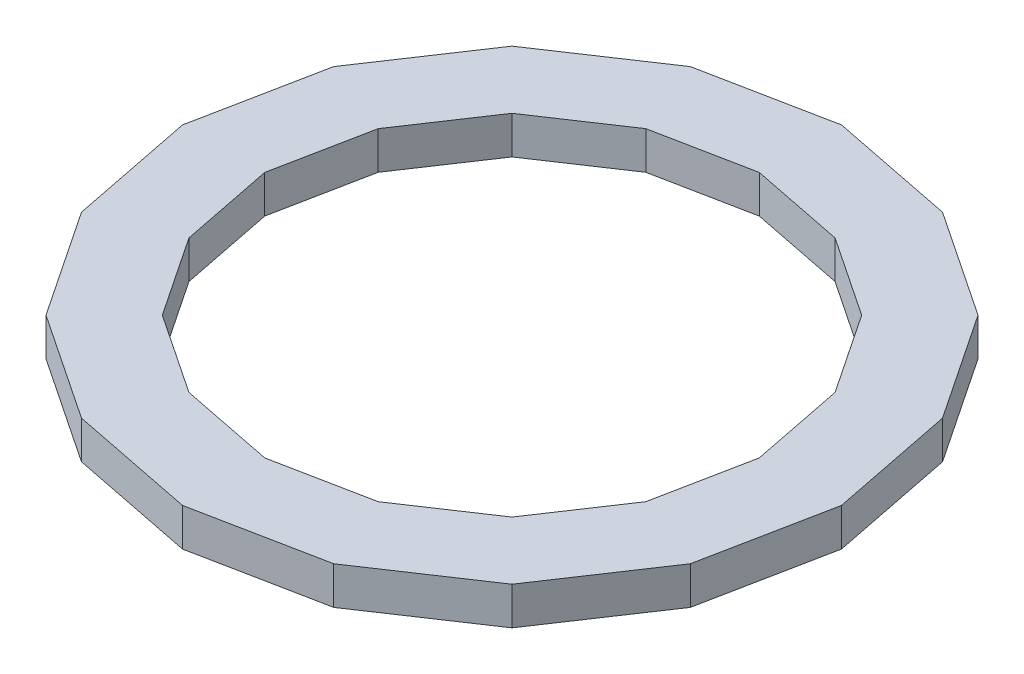
ISO-10303-21;
HEADER;
FILE_DESCRIPTION(('STEP AP214'),'2;1');
FILE_NAME('part.step','',(''),(''),'','','');
FILE_SCHEMA(('AUTOMOTIVE_DESIGN { 1 0 10303 214 1 1 1 1 }'));
ENDSEC;
DATA;
#1=APPLICATION_CONTEXT('core data for automotive mechanical design processes');
#2=APPLICATION_PROTOCOL_DEFINITION('international standard','automotive_design',2000,#1);
#3=PRODUCT_CONTEXT('',#1,'mechanical');
#4=PRODUCT('Part','Part','',(#3));
#5=PRODUCT_RELATED_PRODUCT_CATEGORY('part','',(#4));
#6=PRODUCT_DEFINITION_FORMATION('','',#4);
#7=PRODUCT_DEFINITION_CONTEXT('part definition',#1,'design');
#8=PRODUCT_DEFINITION('design','',#6,#7);
#9=PRODUCT_DEFINITION_SHAPE('','',#8);
#10=(LENGTH_UNIT() NAMED_UNIT(*) SI_UNIT(.MILLI.,.METRE.));
#11=(NAMED_UNIT(*) PLANE_ANGLE_UNIT() SI_UNIT($,.RADIAN.));
#12=(NAMED_UNIT(*) SI_UNIT($,.STERADIAN.) SOLID_ANGLE_UNIT());
#13=UNCERTAINTY_MEASURE_WITH_UNIT(LENGTH_MEASURE(1.E-05),#10,'distance_accuracy_value','');
#14=(GEOMETRIC_REPRESENTATION_CONTEXT(3) GLOBAL_UNCERTAINTY_ASSIGNED_CONTEXT((#13)) GLOBAL_UNIT_ASSIGNED_CONTEXT((#10,
#11,#12)) REPRESENTATION_CONTEXT('',''));
#15=CARTESIAN_POINT('',(0.,0.,0.));
#16=DIRECTION('',(0.,0.,1.));
#17=DIRECTION('',(1.,0.,0.));
#18=AXIS2_PLACEMENT_3D('',#15,#16,#17);
#19=CARTESIAN_POINT('',(0.,19.05,0.));
#20=DIRECTION('',(0.,1.,0.));
#21=DIRECTION('',(0.,0.,1.));
#22=AXIS2_PLACEMENT_3D('',#19,#20,#21);
#23=PLANE('',#22);
#24=DIRECTION('',(0.195090322016117,0.,-0.980785280403233));
#25=VECTOR('',#24,1.);
#26=CARTESIAN_POINT('',(153.364033393234,19.05,63.5254626117155));
#27=LINE('',#26,#25);
#28=CARTESIAN_POINT('',(153.364033393234,19.05,63.5254626117155));
#29=VERTEX_POINT('',#28);
#30=CARTESIAN_POINT('',(166.000033550218,19.05,-1.92901743612494E-12));
#31=VERTEX_POINT('',#30);
#32=EDGE_CURVE('E384',#29,#31,#27,.T.);
#33=ORIENTED_EDGE('',*,*,#32,.T.);
#34=DIRECTION('',(-0.19509032201614,0.,-0.980785280403228));
#35=VECTOR('',#34,1.);
#36=CARTESIAN_POINT('',(166.000033550218,19.05,-1.92901743612494E-12));
#37=LINE('',#36,#35);
#38=CARTESIAN_POINT('',(153.364033393232,19.05,-63.525462611719));
#39=VERTEX_POINT('',#38);
#40=EDGE_CURVE('E388',#31,#39,#37,.T.);
#41=ORIENTED_EDGE('',*,*,#40,.T.);
#42=DIRECTION('',(-0.555570233019612,0.,-0.831469612302539));
#43=VECTOR('',#42,1.);
#44=CARTESIAN_POINT('',(153.364033393232,19.05,-63.525462611719));
#45=LINE('',#44,#43);
#46=CARTESIAN_POINT('',(117.379749400552,19.05,-117.379749400555));
#47=VERTEX_POINT('',#46);
#48=EDGE_CURVE('E392',#39,#47,#45,.T.);
#49=ORIENTED_EDGE('',*,*,#48,.T.);
#50=DIRECTION('',(-0.831469612302551,0.,-0.555570233019593));
#51=VECTOR('',#50,1.);
#52=CARTESIAN_POINT('',(117.379749400552,19.05,-117.379749400555));
#53=LINE('',#52,#51);
#54=CARTESIAN_POINT('',(63.5254626117157,19.05,-153.364033393234));
#55=VERTEX_POINT('',#54);
#56=EDGE_CURVE('E395',#47,#55,#53,.T.);
#57=ORIENTED_EDGE('',*,*,#56,.T.);
#58=DIRECTION('',(-0.980785280403233,0.,-0.195090322016117));
#59=VECTOR('',#58,1.);
#60=CARTESIAN_POINT('',(63.5254626117157,19.05,-153.364033393234));
#61=LINE('',#60,#59);
#62=CARTESIAN_POINT('',(-1.97192316033267E-12,19.05,-166.000033550217));
#63=VERTEX_POINT('',#62);
#64=EDGE_CURVE('E397',#55,#63,#61,.T.);
#65=ORIENTED_EDGE('',*,*,#64,.T.);
#66=DIRECTION('',(-0.980785280403228,0.,0.195090322016139));
#67=VECTOR('',#66,1.);
#68=CARTESIAN_POINT('',(-1.97192316033267E-12,19.05,-166.000033550217));
#69=LINE('',#68,#67);
#70=CARTESIAN_POINT('',(-63.5254626117191,19.05,-153.364033393232));
#71=VERTEX_POINT('',#70);
#72=EDGE_CURVE('E399',#63,#71,#69,.T.);
#73=ORIENTED_EDGE('',*,*,#72,.T.);
#74=DIRECTION('',(-0.831469612302539,0.,0.555570233019612));
#75=VECTOR('',#74,1.);
#76=CARTESIAN_POINT('',(-63.5254626117191,19.05,-153.364033393232));
#77=LINE('',#76,#75);
#78=CARTESIAN_POINT('',(-117.379749400554,19.05,-117.379749400552));
#79=VERTEX_POINT('',#78);
#80=EDGE_CURVE('E402',#71,#79,#77,.T.);
#81=ORIENTED_EDGE('',*,*,#80,.T.);
#82=DIRECTION('',(-0.555570233019593,0.,0.831469612302552));
#83=VECTOR('',#82,1.);
#84=CARTESIAN_POINT('',(-117.379749400554,19.05,-117.379749400552));
#85=LINE('',#84,#83);
#86=CARTESIAN_POINT('',(-153.364033393234,19.05,-63.5254626117154));
#87=VERTEX_POINT('',#86);
#88=EDGE_CURVE('E404',#79,#87,#85,.T.);
#89=ORIENTED_EDGE('',*,*,#88,.T.);
#90=DIRECTION('',(-0.195090322016117,0.,0.980785280403233));
#91=VECTOR('',#90,1.);
#92=CARTESIAN_POINT('',(-153.364033393234,19.05,-63.5254626117154));
#93=LINE('',#92,#91);
#94=CARTESIAN_POINT('',(-166.000033550217,19.05,1.93708909736286E-12));
#95=VERTEX_POINT('',#94);
#96=EDGE_CURVE('E406',#87,#95,#93,.T.);
#97=ORIENTED_EDGE('',*,*,#96,.T.);
#98=DIRECTION('',(0.19509032201614,0.,0.980785280403228));
#99=VECTOR('',#98,1.);
#100=CARTESIAN_POINT('',(-166.000033550217,19.05,1.93708909736286E-12));
#101=LINE('',#100,#99);
#102=CARTESIAN_POINT('',(-153.364033393232,19.05,63.525462611719));
#103=VERTEX_POINT('',#102);
#104=EDGE_CURVE('E408',#95,#103,#101,.T.);
#105=ORIENTED_EDGE('',*,*,#104,.T.);
#106=DIRECTION('',(0.555570233019611,0.,0.831469612302539));
#107=VECTOR('',#106,1.);
#108=CARTESIAN_POINT('',(-153.364033393232,19.05,63.525462611719));
#109=LINE('',#108,#107);
#110=CARTESIAN_POINT('',(-117.379749400552,19.05,117.379749400555));
#111=VERTEX_POINT('',#110);
#112=EDGE_CURVE('E410',#103,#111,#109,.T.);
#113=ORIENTED_EDGE('',*,*,#112,.T.);
#114=DIRECTION('',(0.831469612302552,0.,0.555570233019593));
#115=VECTOR('',#114,1.);
#116=CARTESIAN_POINT('',(-117.379749400552,19.05,117.379749400555));
#117=LINE('',#116,#115);
#118=CARTESIAN_POINT('',(-63.5254626117156,19.05,153.364033393234));
#119=VERTEX_POINT('',#118);
#120=EDGE_CURVE('E412',#111,#119,#117,.T.);
#121=ORIENTED_EDGE('',*,*,#120,.T.);
#122=DIRECTION('',(0.980785280403233,0.,0.195090322016117));
#123=VECTOR('',#122,1.);
#124=CARTESIAN_POINT('',(-63.5254626117156,19.05,153.364033393234));
#125=LINE('',#124,#123);
#126=CARTESIAN_POINT('',(1.87331270362792E-12,19.05,166.000033550217));
#127=VERTEX_POINT('',#126);
#128=EDGE_CURVE('E414',#119,#127,#125,.T.);
#129=ORIENTED_EDGE('',*,*,#128,.T.);
#130=DIRECTION('',(0.980785280403228,0.,-0.195090322016139));
#131=VECTOR('',#130,1.);
#132=CARTESIAN_POINT('',(1.87331270362792E-12,19.05,166.000033550217));
#133=LINE('',#132,#131);
#134=CARTESIAN_POINT('',(63.5254626117191,19.05,153.364033393232));
#135=VERTEX_POINT('',#134);
#136=EDGE_CURVE('E416',#127,#135,#133,.T.);
#137=ORIENTED_EDGE('',*,*,#136,.T.);
#138=DIRECTION('',(0.831469612302539,0.,-0.555570233019612));
#139=VECTOR('',#138,1.);
#140=CARTESIAN_POINT('',(63.5254626117191,19.05,153.364033393232));
#141=LINE('',#140,#139);
#142=CARTESIAN_POINT('',(117.379749400555,19.05,117.379749400552));
#143=VERTEX_POINT('',#142);
#144=EDGE_CURVE('E418',#135,#143,#141,.T.);
#145=ORIENTED_EDGE('',*,*,#144,.T.);
#146=DIRECTION('',(0.555570233019593,0.,-0.831469612302551));
#147=VECTOR('',#146,1.);
#148=CARTESIAN_POINT('',(117.379749400555,19.05,117.379749400552));
#149=LINE('',#148,#147);
#150=EDGE_CURVE('E420',#143,#29,#149,.T.);
#151=ORIENTED_EDGE('',*,*,#150,.T.);
#152=EDGE_LOOP('',(#33,#41,#49,#57,#65,#73,#81,#89,#97,#105,#113,#121,#129,#137,#145,#151));
#153=FACE_BOUND('',#152,.T.);
#154=DIRECTION('',(-0.19509032201614,0.,-0.980785280403228));
#155=VECTOR('',#154,1.);
#156=CARTESIAN_POINT('',(124.563848880631,19.05,-1.45694102306958E-12));
#157=LINE('',#156,#155);
#158=CARTESIAN_POINT('',(124.563848880631,19.05,-1.45694102306958E-12));
#159=VERTEX_POINT('',#158);
#160=CARTESIAN_POINT('',(115.081990471644,19.05,-47.6685212382477));
#161=VERTEX_POINT('',#160);
#162=EDGE_CURVE('E253',#159,#161,#157,.T.);
#163=ORIENTED_EDGE('',*,*,#162,.F.);
#164=DIRECTION('',(0.195090322016117,0.,-0.980785280403233));
#165=VECTOR('',#164,1.);
#166=CARTESIAN_POINT('',(115.081990471645,19.05,47.668521238245));
#167=LINE('',#166,#165);
#168=CARTESIAN_POINT('',(115.081990471645,19.05,47.668521238245));
#169=VERTEX_POINT('',#168);
#170=EDGE_CURVE('E244',#169,#159,#167,.T.);
#171=ORIENTED_EDGE('',*,*,#170,.F.);
#172=DIRECTION('',(0.555570233019593,0.,-0.831469612302552));
#173=VECTOR('',#172,1.);
#174=CARTESIAN_POINT('',(88.0799422341919,19.05,88.0799422341898));
#175=LINE('',#174,#173);
#176=CARTESIAN_POINT('',(88.0799422341919,19.05,88.0799422341898));
#177=VERTEX_POINT('',#176);
#178=EDGE_CURVE('E305',#177,#169,#175,.T.);
#179=ORIENTED_EDGE('',*,*,#178,.F.);
#180=DIRECTION('',(0.831469612302539,0.,-0.555570233019612));
#181=VECTOR('',#180,1.);
#182=CARTESIAN_POINT('',(47.6685212382477,19.05,115.081990471644));
#183=LINE('',#182,#181);
#184=CARTESIAN_POINT('',(47.6685212382477,19.05,115.081990471644));
#185=VERTEX_POINT('',#184);
#186=EDGE_CURVE('E303',#185,#177,#183,.T.);
#187=ORIENTED_EDGE('',*,*,#186,.F.);
#188=DIRECTION('',(0.980785280403228,0.,-0.19509032201614));
#189=VECTOR('',#188,1.);
#190=CARTESIAN_POINT('',(1.41953565217536E-12,19.05,124.563848880631));
#191=LINE('',#190,#189);
#192=CARTESIAN_POINT('',(1.41953565217536E-12,19.05,124.563848880631));
#193=VERTEX_POINT('',#192);
#194=EDGE_CURVE('E301',#193,#185,#191,.T.);
#195=ORIENTED_EDGE('',*,*,#194,.F.);
#196=DIRECTION('',(0.980785280403233,0.,0.195090322016117));
#197=VECTOR('',#196,1.);
#198=CARTESIAN_POINT('',(-47.6685212382451,19.05,115.081990471645));
#199=LINE('',#198,#197);
#200=CARTESIAN_POINT('',(-47.6685212382451,19.05,115.081990471645));
#201=VERTEX_POINT('',#200);
#202=EDGE_CURVE('E299',#201,#193,#199,.T.);
#203=ORIENTED_EDGE('',*,*,#202,.F.);
#204=DIRECTION('',(0.831469612302552,0.,0.555570233019592));
#205=VECTOR('',#204,1.);
#206=CARTESIAN_POINT('',(-88.0799422341898,19.05,88.0799422341919));
#207=LINE('',#206,#205);
#208=CARTESIAN_POINT('',(-88.0799422341898,19.05,88.0799422341919));
#209=VERTEX_POINT('',#208);
#210=EDGE_CURVE('E297',#209,#201,#207,.T.);
#211=ORIENTED_EDGE('',*,*,#210,.F.);
#212=DIRECTION('',(0.555570233019612,0.,0.831469612302539));
#213=VECTOR('',#212,1.);
#214=CARTESIAN_POINT('',(-115.081990471644,19.05,47.6685212382478));
#215=LINE('',#214,#213);
#216=CARTESIAN_POINT('',(-115.081990471644,19.05,47.6685212382478));
#217=VERTEX_POINT('',#216);
#218=EDGE_CURVE('E294',#217,#209,#215,.T.);
#219=ORIENTED_EDGE('',*,*,#218,.F.);
#220=DIRECTION('',(0.19509032201614,0.,0.980785280403228));
#221=VECTOR('',#220,1.);
#222=CARTESIAN_POINT('',(-124.563848880631,19.05,1.42239633256056E-12));
#223=LINE('',#222,#221);
#224=CARTESIAN_POINT('',(-124.563848880631,19.05,1.42239633256056E-12));
#225=VERTEX_POINT('',#224);
#226=EDGE_CURVE('E292',#225,#217,#223,.T.);
#227=ORIENTED_EDGE('',*,*,#226,.F.);
#228=DIRECTION('',(-0.195090322016117,0.,0.980785280403233));
#229=VECTOR('',#228,1.);
#230=CARTESIAN_POINT('',(-115.081990471645,19.05,-47.668521238245));
#231=LINE('',#230,#229);
#232=CARTESIAN_POINT('',(-115.081990471645,19.05,-47.668521238245));
#233=VERTEX_POINT('',#232);
#234=EDGE_CURVE('E289',#233,#225,#231,.T.);
#235=ORIENTED_EDGE('',*,*,#234,.F.);
#236=DIRECTION('',(-0.555570233019592,0.,0.831469612302552));
#237=VECTOR('',#236,1.);
#238=CARTESIAN_POINT('',(-88.0799422341919,19.05,-88.0799422341898));
#239=LINE('',#238,#237);
#240=CARTESIAN_POINT('',(-88.0799422341919,19.05,-88.0799422341898));
#241=VERTEX_POINT('',#240);
#242=EDGE_CURVE('E286',#241,#233,#239,.T.);
#243=ORIENTED_EDGE('',*,*,#242,.F.);
#244=DIRECTION('',(-0.831469612302539,0.,0.555570233019612));
#245=VECTOR('',#244,1.);
#246=CARTESIAN_POINT('',(-47.6685212382478,19.05,-115.081990471644));
#247=LINE('',#246,#245);
#248=CARTESIAN_POINT('',(-47.6685212382478,19.05,-115.081990471644));
#249=VERTEX_POINT('',#248);
#250=EDGE_CURVE('E283',#249,#241,#247,.T.);
#251=ORIENTED_EDGE('',*,*,#250,.F.);
#252=DIRECTION('',(-0.980785280403228,0.,0.19509032201614));
#253=VECTOR('',#252,1.);
#254=CARTESIAN_POINT('',(-1.54699223464568E-12,19.05,-124.563848880631));
#255=LINE('',#254,#253);
#256=CARTESIAN_POINT('',(-1.54699223464568E-12,19.05,-124.563848880631));
#257=VERTEX_POINT('',#256);
#258=EDGE_CURVE('E281',#257,#249,#255,.T.);
#259=ORIENTED_EDGE('',*,*,#258,.F.);
#260=DIRECTION('',(-0.980785280403233,0.,-0.195090322016117));
#261=VECTOR('',#260,1.);
#262=CARTESIAN_POINT('',(47.6685212382451,19.05,-115.081990471645));
#263=LINE('',#262,#261);
#264=CARTESIAN_POINT('',(47.6685212382451,19.05,-115.081990471645));
#265=VERTEX_POINT('',#264);
#266=EDGE_CURVE('E278',#265,#257,#263,.T.);
#267=ORIENTED_EDGE('',*,*,#266,.F.);
#268=DIRECTION('',(-0.831469612302552,0.,-0.555570233019592));
#269=VECTOR('',#268,1.);
#270=CARTESIAN_POINT('',(88.0799422341898,19.05,-88.0799422341919));
#271=LINE('',#270,#269);
#272=CARTESIAN_POINT('',(88.0799422341898,19.05,-88.0799422341919));
#273=VERTEX_POINT('',#272);
#274=EDGE_CURVE('E273',#273,#265,#271,.T.);
#275=ORIENTED_EDGE('',*,*,#274,.F.);
#276=DIRECTION('',(-0.555570233019612,0.,-0.831469612302539));
#277=VECTOR('',#276,1.);
#278=CARTESIAN_POINT('',(115.081990471644,19.05,-47.6685212382477));
#279=LINE('',#278,#277);
#280=EDGE_CURVE('E266',#161,#273,#279,.T.);
#281=ORIENTED_EDGE('',*,*,#280,.F.);
#282=EDGE_LOOP('',(#163,#171,#179,#187,#195,#203,#211,#219,#227,#235,#243,#251,#259,#267,#275,#281));
#283=FACE_BOUND('',#282,.T.);
#284=ADVANCED_FACE('F35',(#153,#283),#23,.T.);
#285=CARTESIAN_POINT('',(0.,0.,0.));
#286=DIRECTION('',(0.,1.,0.));
#287=DIRECTION('',(0.,0.,1.));
#288=AXIS2_PLACEMENT_3D('',#285,#286,#287);
#289=PLANE('',#288);
#290=DIRECTION('',(0.195090322016117,0.,-0.980785280403233));
#291=VECTOR('',#290,1.);
#292=CARTESIAN_POINT('',(153.364033393234,0.,63.5254626117155));
#293=LINE('',#292,#291);
#294=CARTESIAN_POINT('',(153.364033393234,0.,63.5254626117155));
#295=VERTEX_POINT('',#294);
#296=CARTESIAN_POINT('',(166.000033550218,0.,-1.92901743612494E-12));
#297=VERTEX_POINT('',#296);
#298=EDGE_CURVE('E261',#295,#297,#293,.T.);
#299=ORIENTED_EDGE('',*,*,#298,.F.);
#300=DIRECTION('',(0.555570233019593,0.,-0.831469612302551));
#301=VECTOR('',#300,1.);
#302=CARTESIAN_POINT('',(117.379749400555,0.,117.379749400552));
#303=LINE('',#302,#301);
#304=CARTESIAN_POINT('',(117.379749400555,0.,117.379749400552));
#305=VERTEX_POINT('',#304);
#306=EDGE_CURVE('E389',#305,#295,#303,.T.);
#307=ORIENTED_EDGE('',*,*,#306,.F.);
#308=DIRECTION('',(0.831469612302539,0.,-0.555570233019612));
#309=VECTOR('',#308,1.);
#310=CARTESIAN_POINT('',(63.5254626117191,0.,153.364033393232));
#311=LINE('',#310,#309);
#312=CARTESIAN_POINT('',(63.5254626117191,0.,153.364033393232));
#313=VERTEX_POINT('',#312);
#314=EDGE_CURVE('E454',#313,#305,#311,.T.);
#315=ORIENTED_EDGE('',*,*,#314,.F.);
#316=DIRECTION('',(0.980785280403228,0.,-0.195090322016139));
#317=VECTOR('',#316,1.);
#318=CARTESIAN_POINT('',(1.87331270362792E-12,0.,166.000033550217));
#319=LINE('',#318,#317);
#320=CARTESIAN_POINT('',(1.87331270362792E-12,0.,166.000033550217));
#321=VERTEX_POINT('',#320);
#322=EDGE_CURVE('E452',#321,#313,#319,.T.);
#323=ORIENTED_EDGE('',*,*,#322,.F.);
#324=DIRECTION('',(0.980785280403233,0.,0.195090322016117));
#325=VECTOR('',#324,1.);
#326=CARTESIAN_POINT('',(-63.5254626117156,0.,153.364033393234));
#327=LINE('',#326,#325);
#328=CARTESIAN_POINT('',(-63.5254626117156,0.,153.364033393234));
#329=VERTEX_POINT('',#328);
#330=EDGE_CURVE('E449',#329,#321,#327,.T.);
#331=ORIENTED_EDGE('',*,*,#330,.F.);
#332=DIRECTION('',(0.831469612302552,0.,0.555570233019593));
#333=VECTOR('',#332,1.);
#334=CARTESIAN_POINT('',(-117.379749400552,0.,117.379749400555));
#335=LINE('',#334,#333);
#336=CARTESIAN_POINT('',(-117.379749400552,0.,117.379749400555));
#337=VERTEX_POINT('',#336);
#338=EDGE_CURVE('E447',#337,#329,#335,.T.);
#339=ORIENTED_EDGE('',*,*,#338,.F.);
#340=DIRECTION('',(0.555570233019611,0.,0.831469612302539));
#341=VECTOR('',#340,1.);
#342=CARTESIAN_POINT('',(-153.364033393232,0.,63.525462611719));
#343=LINE('',#342,#341);
#344=CARTESIAN_POINT('',(-153.364033393232,0.,63.525462611719));
#345=VERTEX_POINT('',#344);
#346=EDGE_CURVE('E445',#345,#337,#343,.T.);
#347=ORIENTED_EDGE('',*,*,#346,.F.);
#348=DIRECTION('',(0.19509032201614,0.,0.980785280403228));
#349=VECTOR('',#348,1.);
#350=CARTESIAN_POINT('',(-166.000033550217,0.,1.93708909736286E-12));
#351=LINE('',#350,#349);
#352=CARTESIAN_POINT('',(-166.000033550217,0.,1.93708909736286E-12));
#353=VERTEX_POINT('',#352);
#354=EDGE_CURVE('E443',#353,#345,#351,.T.);
#355=ORIENTED_EDGE('',*,*,#354,.F.);
#356=DIRECTION('',(-0.195090322016117,0.,0.980785280403233));
#357=VECTOR('',#356,1.);
#358=CARTESIAN_POINT('',(-153.364033393234,0.,-63.5254626117154));
#359=LINE('',#358,#357);
#360=CARTESIAN_POINT('',(-153.364033393234,0.,-63.5254626117154));
#361=VERTEX_POINT('',#360);
#362=EDGE_CURVE('E441',#361,#353,#359,.T.);
#363=ORIENTED_EDGE('',*,*,#362,.F.);
#364=DIRECTION('',(-0.555570233019593,0.,0.831469612302552));
#365=VECTOR('',#364,1.);
#366=CARTESIAN_POINT('',(-117.379749400554,0.,-117.379749400552));
#367=LINE('',#366,#365);
#368=CARTESIAN_POINT('',(-117.379749400554,0.,-117.379749400552));
#369=VERTEX_POINT('',#368);
#370=EDGE_CURVE('E439',#369,#361,#367,.T.);
#371=ORIENTED_EDGE('',*,*,#370,.F.);
#372=DIRECTION('',(-0.831469612302539,0.,0.555570233019612));
#373=VECTOR('',#372,1.);
#374=CARTESIAN_POINT('',(-63.5254626117191,0.,-153.364033393232));
#375=LINE('',#374,#373);
#376=CARTESIAN_POINT('',(-63.5254626117191,0.,-153.364033393232));
#377=VERTEX_POINT('',#376);
#378=EDGE_CURVE('E437',#377,#369,#375,.T.);
#379=ORIENTED_EDGE('',*,*,#378,.F.);
#380=DIRECTION('',(-0.980785280403228,0.,0.195090322016139));
#381=VECTOR('',#380,1.);
#382=CARTESIAN_POINT('',(-1.97192316033267E-12,0.,-166.000033550217));
#383=LINE('',#382,#381);
#384=CARTESIAN_POINT('',(-1.97192316033267E-12,0.,-166.000033550217));
#385=VERTEX_POINT('',#384);
#386=EDGE_CURVE('E435',#385,#377,#383,.T.);
#387=ORIENTED_EDGE('',*,*,#386,.F.);
#388=DIRECTION('',(-0.980785280403233,0.,-0.195090322016117));
#389=VECTOR('',#388,1.);
#390=CARTESIAN_POINT('',(63.5254626117157,0.,-153.364033393234));
#391=LINE('',#390,#389);
#392=CARTESIAN_POINT('',(63.5254626117157,0.,-153.364033393234));
#393=VERTEX_POINT('',#392);
#394=EDGE_CURVE('E433',#393,#385,#391,.T.);
#395=ORIENTED_EDGE('',*,*,#394,.F.);
#396=DIRECTION('',(-0.831469612302551,0.,-0.555570233019593));
#397=VECTOR('',#396,1.);
#398=CARTESIAN_POINT('',(117.379749400552,0.,-117.379749400555));
#399=LINE('',#398,#397);
#400=CARTESIAN_POINT('',(117.379749400552,0.,-117.379749400555));
#401=VERTEX_POINT('',#400);
#402=EDGE_CURVE('E431',#401,#393,#399,.T.);
#403=ORIENTED_EDGE('',*,*,#402,.F.);
#404=DIRECTION('',(-0.555570233019612,0.,-0.831469612302539));
#405=VECTOR('',#404,1.);
#406=CARTESIAN_POINT('',(153.364033393232,0.,-63.525462611719));
#407=LINE('',#406,#405);
#408=CARTESIAN_POINT('',(153.364033393232,0.,-63.525462611719));
#409=VERTEX_POINT('',#408);
#410=EDGE_CURVE('E428',#409,#401,#407,.T.);
#411=ORIENTED_EDGE('',*,*,#410,.F.);
#412=DIRECTION('',(-0.19509032201614,0.,-0.980785280403228));
#413=VECTOR('',#412,1.);
#414=CARTESIAN_POINT('',(166.000033550218,0.,-1.92901743612494E-12));
#415=LINE('',#414,#413);
#416=EDGE_CURVE('E425',#297,#409,#415,.T.);
#417=ORIENTED_EDGE('',*,*,#416,.F.);
#418=EDGE_LOOP('',(#299,#307,#315,#323,#331,#339,#347,#355,#363,#371,#379,#387,#395,#403,#411,#417));
#419=FACE_BOUND('',#418,.T.);
#420=DIRECTION('',(0.195090322016117,0.,-0.980785280403233));
#421=VECTOR('',#420,1.);
#422=CARTESIAN_POINT('',(115.081990471645,0.,47.668521238245));
#423=LINE('',#422,#421);
#424=CARTESIAN_POINT('',(115.081990471645,0.,47.668521238245));
#425=VERTEX_POINT('',#424);
#426=CARTESIAN_POINT('',(124.563848880631,0.,-1.45694102306958E-12));
#427=VERTEX_POINT('',#426);
#428=EDGE_CURVE('E58',#425,#427,#423,.T.);
#429=ORIENTED_EDGE('',*,*,#428,.T.);
#430=DIRECTION('',(-0.19509032201614,0.,-0.980785280403228));
#431=VECTOR('',#430,1.);
#432=CARTESIAN_POINT('',(124.563848880631,0.,-1.45694102306958E-12));
#433=LINE('',#432,#431);
#434=CARTESIAN_POINT('',(115.081990471644,0.,-47.6685212382477));
#435=VERTEX_POINT('',#434);
#436=EDGE_CURVE('E260',#427,#435,#433,.T.);
#437=ORIENTED_EDGE('',*,*,#436,.T.);
#438=DIRECTION('',(-0.555570233019612,0.,-0.831469612302539));
#439=VECTOR('',#438,1.);
#440=CARTESIAN_POINT('',(115.081990471644,0.,-47.6685212382477));
#441=LINE('',#440,#439);
#442=CARTESIAN_POINT('',(88.0799422341898,0.,-88.0799422341919));
#443=VERTEX_POINT('',#442);
#444=EDGE_CURVE('E311',#435,#443,#441,.T.);
#445=ORIENTED_EDGE('',*,*,#444,.T.);
#446=DIRECTION('',(-0.831469612302552,0.,-0.555570233019592));
#447=VECTOR('',#446,1.);
#448=CARTESIAN_POINT('',(88.0799422341898,0.,-88.0799422341919));
#449=LINE('',#448,#447);
#450=CARTESIAN_POINT('',(47.6685212382451,0.,-115.081990471645));
#451=VERTEX_POINT('',#450);
#452=EDGE_CURVE('E315',#443,#451,#449,.T.);
#453=ORIENTED_EDGE('',*,*,#452,.T.);
#454=DIRECTION('',(-0.980785280403233,0.,-0.195090322016117));
#455=VECTOR('',#454,1.);
#456=CARTESIAN_POINT('',(47.6685212382451,0.,-115.081990471645));
#457=LINE('',#456,#455);
#458=CARTESIAN_POINT('',(-1.54699223464568E-12,0.,-124.563848880631));
#459=VERTEX_POINT('',#458);
#460=EDGE_CURVE('E319',#451,#459,#457,.T.);
#461=ORIENTED_EDGE('',*,*,#460,.T.);
#462=DIRECTION('',(-0.980785280403228,0.,0.19509032201614));
#463=VECTOR('',#462,1.);
#464=CARTESIAN_POINT('',(-1.54699223464568E-12,0.,-124.563848880631));
#465=LINE('',#464,#463);
#466=CARTESIAN_POINT('',(-47.6685212382478,0.,-115.081990471644));
#467=VERTEX_POINT('',#466);
#468=EDGE_CURVE('E323',#459,#467,#465,.T.);
#469=ORIENTED_EDGE('',*,*,#468,.T.);
#470=DIRECTION('',(-0.831469612302539,0.,0.555570233019612));
#471=VECTOR('',#470,1.);
#472=CARTESIAN_POINT('',(-47.6685212382478,0.,-115.081990471644));
#473=LINE('',#472,#471);
#474=CARTESIAN_POINT('',(-88.0799422341919,0.,-88.0799422341898));
#475=VERTEX_POINT('',#474);
#476=EDGE_CURVE('E327',#467,#475,#473,.T.);
#477=ORIENTED_EDGE('',*,*,#476,.T.);
#478=DIRECTION('',(-0.555570233019592,0.,0.831469612302552));
#479=VECTOR('',#478,1.);
#480=CARTESIAN_POINT('',(-88.0799422341919,0.,-88.0799422341898));
#481=LINE('',#480,#479);
#482=CARTESIAN_POINT('',(-115.081990471645,0.,-47.668521238245));
#483=VERTEX_POINT('',#482);
#484=EDGE_CURVE('E331',#475,#483,#481,.T.);
#485=ORIENTED_EDGE('',*,*,#484,.T.);
#486=DIRECTION('',(-0.195090322016117,0.,0.980785280403233));
#487=VECTOR('',#486,1.);
#488=CARTESIAN_POINT('',(-115.081990471645,0.,-47.668521238245));
#489=LINE('',#488,#487);
#490=CARTESIAN_POINT('',(-124.563848880631,0.,1.42239633256056E-12));
#491=VERTEX_POINT('',#490);
#492=EDGE_CURVE('E334',#483,#491,#489,.T.);
#493=ORIENTED_EDGE('',*,*,#492,.T.);
#494=DIRECTION('',(0.19509032201614,0.,0.980785280403228));
#495=VECTOR('',#494,1.);
#496=CARTESIAN_POINT('',(-124.563848880631,0.,1.42239633256056E-12));
#497=LINE('',#496,#495);
#498=CARTESIAN_POINT('',(-115.081990471644,0.,47.6685212382478));
#499=VERTEX_POINT('',#498);
#500=EDGE_CURVE('E337',#491,#499,#497,.T.);
#501=ORIENTED_EDGE('',*,*,#500,.T.);
#502=DIRECTION('',(0.555570233019612,0.,0.831469612302539));
#503=VECTOR('',#502,1.);
#504=CARTESIAN_POINT('',(-115.081990471644,0.,47.6685212382478));
#505=LINE('',#504,#503);
#506=CARTESIAN_POINT('',(-88.0799422341898,0.,88.0799422341919));
#507=VERTEX_POINT('',#506);
#508=EDGE_CURVE('E340',#499,#507,#505,.T.);
#509=ORIENTED_EDGE('',*,*,#508,.T.);
#510=DIRECTION('',(0.831469612302552,0.,0.555570233019592));
#511=VECTOR('',#510,1.);
#512=CARTESIAN_POINT('',(-88.0799422341898,0.,88.0799422341919));
#513=LINE('',#512,#511);
#514=CARTESIAN_POINT('',(-47.6685212382451,0.,115.081990471645));
#515=VERTEX_POINT('',#514);
#516=EDGE_CURVE('E343',#507,#515,#513,.T.);
#517=ORIENTED_EDGE('',*,*,#516,.T.);
#518=DIRECTION('',(0.980785280403233,0.,0.195090322016117));
#519=VECTOR('',#518,1.);
#520=CARTESIAN_POINT('',(-47.6685212382451,0.,115.081990471645));
#521=LINE('',#520,#519);
#522=CARTESIAN_POINT('',(1.41953565217536E-12,0.,124.563848880631));
#523=VERTEX_POINT('',#522);
#524=EDGE_CURVE('E346',#515,#523,#521,.T.);
#525=ORIENTED_EDGE('',*,*,#524,.T.);
#526=DIRECTION('',(0.980785280403228,0.,-0.19509032201614));
#527=VECTOR('',#526,1.);
#528=CARTESIAN_POINT('',(1.41953565217536E-12,0.,124.563848880631));
#529=LINE('',#528,#527);
#530=CARTESIAN_POINT('',(47.6685212382477,0.,115.081990471644));
#531=VERTEX_POINT('',#530);
#532=EDGE_CURVE('E349',#523,#531,#529,.T.);
#533=ORIENTED_EDGE('',*,*,#532,.T.);
#534=DIRECTION('',(0.831469612302539,0.,-0.555570233019612));
#535=VECTOR('',#534,1.);
#536=CARTESIAN_POINT('',(47.6685212382477,0.,115.081990471644));
#537=LINE('',#536,#535);
#538=CARTESIAN_POINT('',(88.0799422341919,0.,88.0799422341898));
#539=VERTEX_POINT('',#538);
#540=EDGE_CURVE('E352',#531,#539,#537,.T.);
#541=ORIENTED_EDGE('',*,*,#540,.T.);
#542=DIRECTION('',(0.555570233019593,0.,-0.831469612302552));
#543=VECTOR('',#542,1.);
#544=CARTESIAN_POINT('',(88.0799422341919,0.,88.0799422341898));
#545=LINE('',#544,#543);
#546=EDGE_CURVE('E254',#539,#425,#545,.T.);
#547=ORIENTED_EDGE('',*,*,#546,.T.);
#548=EDGE_LOOP('',(#429,#437,#445,#453,#461,#469,#477,#485,#493,#501,#509,#517,#525,#533,#541,#547));
#549=FACE_BOUND('',#548,.T.);
#550=ADVANCED_FACE('F514',(#419,#549),#289,.F.);
#551=CARTESIAN_POINT('',(153.364033393234,19.05,63.5254626117155));
#552=DIRECTION('',(-0.980785280403233,0.,-0.195090322016117));
#553=DIRECTION('',(-0.195090322016117,0.,0.980785280403233));
#554=AXIS2_PLACEMENT_3D('',#551,#552,#553);
#555=PLANE('',#554);
#556=ORIENTED_EDGE('',*,*,#298,.T.);
#557=DIRECTION('',(0.,-1.,0.));
#558=VECTOR('',#557,1.);
#559=CARTESIAN_POINT('',(166.000033550218,19.05,-1.92901743612494E-12));
#560=LINE('',#559,#558);
#561=EDGE_CURVE('E11',#31,#297,#560,.T.);
#562=ORIENTED_EDGE('',*,*,#561,.F.);
#563=ORIENTED_EDGE('',*,*,#32,.F.);
#564=DIRECTION('',(0.,-1.,0.));
#565=VECTOR('',#564,1.);
#566=CARTESIAN_POINT('',(153.364033393234,19.05,63.5254626117155));
#567=LINE('',#566,#565);
#568=EDGE_CURVE('E422',#29,#295,#567,.T.);
#569=ORIENTED_EDGE('',*,*,#568,.T.);
#570=EDGE_LOOP('',(#556,#562,#563,#569));
#571=FACE_BOUND('',#570,.T.);
#572=ADVANCED_FACE('F37',(#571),#555,.F.);
#573=CARTESIAN_POINT('',(166.000033550218,19.05,-1.92901743612494E-12));
#574=DIRECTION('',(-0.980785280403228,0.,0.19509032201614));
#575=DIRECTION('',(0.19509032201614,0.,0.980785280403228));
#576=AXIS2_PLACEMENT_3D('',#573,#574,#575);
#577=PLANE('',#576);
#578=ORIENTED_EDGE('',*,*,#416,.T.);
#579=DIRECTION('',(0.,-1.,0.));
#580=VECTOR('',#579,1.);
#581=CARTESIAN_POINT('',(153.364033393232,19.05,-63.525462611719));
#582=LINE('',#581,#580);
#583=EDGE_CURVE('E43',#39,#409,#582,.T.);
#584=ORIENTED_EDGE('',*,*,#583,.F.);
#585=ORIENTED_EDGE('',*,*,#40,.F.);
#586=ORIENTED_EDGE('',*,*,#561,.T.);
#587=EDGE_LOOP('',(#578,#584,#585,#586));
#588=FACE_BOUND('',#587,.T.);
#589=ADVANCED_FACE('F531',(#588),#577,.F.);
#590=CARTESIAN_POINT('',(153.364033393232,19.05,-63.525462611719));
#591=DIRECTION('',(-0.831469612302539,0.,0.555570233019612));
#592=DIRECTION('',(0.555570233019612,0.,0.831469612302539));
#593=AXIS2_PLACEMENT_3D('',#590,#591,#592);
#594=PLANE('',#593);
#595=ORIENTED_EDGE('',*,*,#410,.T.);
#596=DIRECTION('',(0.,-1.,0.));
#597=VECTOR('',#596,1.);
#598=CARTESIAN_POINT('',(117.379749400552,19.05,-117.379749400555));
#599=LINE('',#598,#597);
#600=EDGE_CURVE('E499',#47,#401,#599,.T.);
#601=ORIENTED_EDGE('',*,*,#600,.F.);
#602=ORIENTED_EDGE('',*,*,#48,.F.);
#603=ORIENTED_EDGE('',*,*,#583,.T.);
#604=EDGE_LOOP('',(#595,#601,#602,#603));
#605=FACE_BOUND('',#604,.T.);
#606=ADVANCED_FACE('F508',(#605),#594,.F.);
#607=CARTESIAN_POINT('',(117.379749400552,19.05,-117.379749400555));
#608=DIRECTION('',(-0.555570233019593,0.,0.831469612302552));
#609=DIRECTION('',(0.831469612302552,0.,0.555570233019593));
#610=AXIS2_PLACEMENT_3D('',#607,#608,#609);
#611=PLANE('',#610);
#612=ORIENTED_EDGE('',*,*,#402,.T.);
#613=DIRECTION('',(0.,-1.,0.));
#614=VECTOR('',#613,1.);
#615=CARTESIAN_POINT('',(63.5254626117157,19.05,-153.364033393234));
#616=LINE('',#615,#614);
#617=EDGE_CURVE('E496',#55,#393,#616,.T.);
#618=ORIENTED_EDGE('',*,*,#617,.F.);
#619=ORIENTED_EDGE('',*,*,#56,.F.);
#620=ORIENTED_EDGE('',*,*,#600,.T.);
#621=EDGE_LOOP('',(#612,#618,#619,#620));
#622=FACE_BOUND('',#621,.T.);
#623=ADVANCED_FACE('F520',(#622),#611,.F.);
#624=CARTESIAN_POINT('',(63.5254626117157,19.05,-153.364033393234));
#625=DIRECTION('',(-0.195090322016117,0.,0.980785280403233));
#626=DIRECTION('',(0.980785280403233,0.,0.195090322016117));
#627=AXIS2_PLACEMENT_3D('',#624,#625,#626);
#628=PLANE('',#627);
#629=ORIENTED_EDGE('',*,*,#394,.T.);
#630=DIRECTION('',(0.,-1.,0.));
#631=VECTOR('',#630,1.);
#632=CARTESIAN_POINT('',(-1.97192316033267E-12,19.05,-166.000033550217));
#633=LINE('',#632,#631);
#634=EDGE_CURVE('E493',#63,#385,#633,.T.);
#635=ORIENTED_EDGE('',*,*,#634,.F.);
#636=ORIENTED_EDGE('',*,*,#64,.F.);
#637=ORIENTED_EDGE('',*,*,#617,.T.);
#638=EDGE_LOOP('',(#629,#635,#636,#637));
#639=FACE_BOUND('',#638,.T.);
#640=ADVANCED_FACE('F524',(#639),#628,.F.);
#641=CARTESIAN_POINT('',(-1.97192316033267E-12,19.05,-166.000033550217));
#642=DIRECTION('',(0.195090322016139,0.,0.980785280403228));
#643=DIRECTION('',(0.980785280403228,0.,-0.195090322016139));
#644=AXIS2_PLACEMENT_3D('',#641,#642,#643);
#645=PLANE('',#644);
#646=ORIENTED_EDGE('',*,*,#386,.T.);
#647=DIRECTION('',(0.,-1.,0.));
#648=VECTOR('',#647,1.);
#649=CARTESIAN_POINT('',(-63.5254626117191,19.05,-153.364033393232));
#650=LINE('',#649,#648);
#651=EDGE_CURVE('E490',#71,#377,#650,.T.);
#652=ORIENTED_EDGE('',*,*,#651,.F.);
#653=ORIENTED_EDGE('',*,*,#72,.F.);
#654=ORIENTED_EDGE('',*,*,#634,.T.);
#655=EDGE_LOOP('',(#646,#652,#653,#654));
#656=FACE_BOUND('',#655,.T.);
#657=ADVANCED_FACE('F584',(#656),#645,.F.);
#658=CARTESIAN_POINT('',(-63.5254626117191,19.05,-153.364033393232));
#659=DIRECTION('',(0.555570233019612,0.,0.831469612302539));
#660=DIRECTION('',(0.831469612302539,0.,-0.555570233019612));
#661=AXIS2_PLACEMENT_3D('',#658,#659,#660);
#662=PLANE('',#661);
#663=ORIENTED_EDGE('',*,*,#378,.T.);
#664=DIRECTION('',(0.,-1.,0.));
#665=VECTOR('',#664,1.);
#666=CARTESIAN_POINT('',(-117.379749400554,19.05,-117.379749400552));
#667=LINE('',#666,#665);
#668=EDGE_CURVE('E486',#79,#369,#667,.T.);
#669=ORIENTED_EDGE('',*,*,#668,.F.);
#670=ORIENTED_EDGE('',*,*,#80,.F.);
#671=ORIENTED_EDGE('',*,*,#651,.T.);
#672=EDGE_LOOP('',(#663,#669,#670,#671));
#673=FACE_BOUND('',#672,.T.);
#674=ADVANCED_FACE('F581',(#673),#662,.F.);
#675=CARTESIAN_POINT('',(-117.379749400554,19.05,-117.379749400552));
#676=DIRECTION('',(0.831469612302552,0.,0.555570233019593));
#677=DIRECTION('',(0.555570233019593,0.,-0.831469612302552));
#678=AXIS2_PLACEMENT_3D('',#675,#676,#677);
#679=PLANE('',#678);
#680=ORIENTED_EDGE('',*,*,#370,.T.);
#681=DIRECTION('',(0.,-1.,0.));
#682=VECTOR('',#681,1.);
#683=CARTESIAN_POINT('',(-153.364033393234,19.05,-63.5254626117154));
#684=LINE('',#683,#682);
#685=EDGE_CURVE('E483',#87,#361,#684,.T.);
#686=ORIENTED_EDGE('',*,*,#685,.F.);
#687=ORIENTED_EDGE('',*,*,#88,.F.);
#688=ORIENTED_EDGE('',*,*,#668,.T.);
#689=EDGE_LOOP('',(#680,#686,#687,#688));
#690=FACE_BOUND('',#689,.T.);
#691=ADVANCED_FACE('F577',(#690),#679,.F.);
#692=CARTESIAN_POINT('',(-153.364033393234,19.05,-63.5254626117154));
#693=DIRECTION('',(0.980785280403233,0.,0.195090322016117));
#694=DIRECTION('',(0.195090322016117,0.,-0.980785280403233));
#695=AXIS2_PLACEMENT_3D('',#692,#693,#694);
#696=PLANE('',#695);
#697=ORIENTED_EDGE('',*,*,#362,.T.);
#698=DIRECTION('',(0.,-1.,0.));
#699=VECTOR('',#698,1.);
#700=CARTESIAN_POINT('',(-166.000033550217,19.05,1.93708909736286E-12));
#701=LINE('',#700,#699);
#702=EDGE_CURVE('E480',#95,#353,#701,.T.);
#703=ORIENTED_EDGE('',*,*,#702,.F.);
#704=ORIENTED_EDGE('',*,*,#96,.F.);
#705=ORIENTED_EDGE('',*,*,#685,.T.);
#706=EDGE_LOOP('',(#697,#703,#704,#705));
#707=FACE_BOUND('',#706,.T.);
#708=ADVANCED_FACE('F573',(#707),#696,.F.);
#709=CARTESIAN_POINT('',(-166.000033550217,19.05,1.93708909736286E-12));
#710=DIRECTION('',(0.980785280403228,0.,-0.19509032201614));
#711=DIRECTION('',(-0.19509032201614,0.,-0.980785280403228));
#712=AXIS2_PLACEMENT_3D('',#709,#710,#711);
#713=PLANE('',#712);
#714=ORIENTED_EDGE('',*,*,#354,.T.);
#715=DIRECTION('',(0.,-1.,0.));
#716=VECTOR('',#715,1.);
#717=CARTESIAN_POINT('',(-153.364033393232,19.05,63.525462611719));
#718=LINE('',#717,#716);
#719=EDGE_CURVE('E477',#103,#345,#718,.T.);
#720=ORIENTED_EDGE('',*,*,#719,.F.);
#721=ORIENTED_EDGE('',*,*,#104,.F.);
#722=ORIENTED_EDGE('',*,*,#702,.T.);
#723=EDGE_LOOP('',(#714,#720,#721,#722));
#724=FACE_BOUND('',#723,.T.);
#725=ADVANCED_FACE('F568',(#724),#713,.F.);
#726=CARTESIAN_POINT('',(-153.364033393232,19.05,63.525462611719));
#727=DIRECTION('',(0.831469612302539,0.,-0.555570233019611));
#728=DIRECTION('',(-0.555570233019611,0.,-0.831469612302539));
#729=AXIS2_PLACEMENT_3D('',#726,#727,#728);
#730=PLANE('',#729);
#731=ORIENTED_EDGE('',*,*,#346,.T.);
#732=DIRECTION('',(0.,-1.,0.));
#733=VECTOR('',#732,1.);
#734=CARTESIAN_POINT('',(-117.379749400552,19.05,117.379749400555));
#735=LINE('',#734,#733);
#736=EDGE_CURVE('E473',#111,#337,#735,.T.);
#737=ORIENTED_EDGE('',*,*,#736,.F.);
#738=ORIENTED_EDGE('',*,*,#112,.F.);
#739=ORIENTED_EDGE('',*,*,#719,.T.);
#740=EDGE_LOOP('',(#731,#737,#738,#739));
#741=FACE_BOUND('',#740,.T.);
#742=ADVANCED_FACE('F562',(#741),#730,.F.);
#743=CARTESIAN_POINT('',(-117.379749400552,19.05,117.379749400555));
#744=DIRECTION('',(0.555570233019593,0.,-0.831469612302552));
#745=DIRECTION('',(-0.831469612302552,0.,-0.555570233019593));
#746=AXIS2_PLACEMENT_3D('',#743,#744,#745);
#747=PLANE('',#746);
#748=ORIENTED_EDGE('',*,*,#338,.T.);
#749=DIRECTION('',(0.,-1.,0.));
#750=VECTOR('',#749,1.);
#751=CARTESIAN_POINT('',(-63.5254626117156,19.05,153.364033393234));
#752=LINE('',#751,#750);
#753=EDGE_CURVE('E470',#119,#329,#752,.T.);
#754=ORIENTED_EDGE('',*,*,#753,.F.);
#755=ORIENTED_EDGE('',*,*,#120,.F.);
#756=ORIENTED_EDGE('',*,*,#736,.T.);
#757=EDGE_LOOP('',(#748,#754,#755,#756));
#758=FACE_BOUND('',#757,.T.);
#759=ADVANCED_FACE('F558',(#758),#747,.F.);
#760=CARTESIAN_POINT('',(-63.5254626117156,19.05,153.364033393234));
#761=DIRECTION('',(0.195090322016117,0.,-0.980785280403233));
#762=DIRECTION('',(-0.980785280403233,0.,-0.195090322016117));
#763=AXIS2_PLACEMENT_3D('',#760,#761,#762);
#764=PLANE('',#763);
#765=ORIENTED_EDGE('',*,*,#330,.T.);
#766=DIRECTION('',(0.,-1.,0.));
#767=VECTOR('',#766,1.);
#768=CARTESIAN_POINT('',(1.87331270362792E-12,19.05,166.000033550217));
#769=LINE('',#768,#767);
#770=EDGE_CURVE('E467',#127,#321,#769,.T.);
#771=ORIENTED_EDGE('',*,*,#770,.F.);
#772=ORIENTED_EDGE('',*,*,#128,.F.);
#773=ORIENTED_EDGE('',*,*,#753,.T.);
#774=EDGE_LOOP('',(#765,#771,#772,#773));
#775=FACE_BOUND('',#774,.T.);
#776=ADVANCED_FACE('F553',(#775),#764,.F.);
#777=CARTESIAN_POINT('',(1.87331270362792E-12,19.05,166.000033550217));
#778=DIRECTION('',(-0.195090322016139,0.,-0.980785280403228));
#779=DIRECTION('',(-0.980785280403228,0.,0.195090322016139));
#780=AXIS2_PLACEMENT_3D('',#777,#778,#779);
#781=PLANE('',#780);
#782=ORIENTED_EDGE('',*,*,#322,.T.);
#783=DIRECTION('',(0.,-1.,0.));
#784=VECTOR('',#783,1.);
#785=CARTESIAN_POINT('',(63.5254626117191,19.05,153.364033393232));
#786=LINE('',#785,#784);
#787=EDGE_CURVE('E463',#135,#313,#786,.T.);
#788=ORIENTED_EDGE('',*,*,#787,.F.);
#789=ORIENTED_EDGE('',*,*,#136,.F.);
#790=ORIENTED_EDGE('',*,*,#770,.T.);
#791=EDGE_LOOP('',(#782,#788,#789,#790));
#792=FACE_BOUND('',#791,.T.);
#793=ADVANCED_FACE('F547',(#792),#781,.F.);
#794=CARTESIAN_POINT('',(63.5254626117191,19.05,153.364033393232));
#795=DIRECTION('',(-0.555570233019612,0.,-0.831469612302539));
#796=DIRECTION('',(-0.831469612302539,0.,0.555570233019612));
#797=AXIS2_PLACEMENT_3D('',#794,#795,#796);
#798=PLANE('',#797);
#799=ORIENTED_EDGE('',*,*,#314,.T.);
#800=DIRECTION('',(0.,-1.,0.));
#801=VECTOR('',#800,1.);
#802=CARTESIAN_POINT('',(117.379749400555,19.05,117.379749400552));
#803=LINE('',#802,#801);
#804=EDGE_CURVE('E460',#143,#305,#803,.T.);
#805=ORIENTED_EDGE('',*,*,#804,.F.);
#806=ORIENTED_EDGE('',*,*,#144,.F.);
#807=ORIENTED_EDGE('',*,*,#787,.T.);
#808=EDGE_LOOP('',(#799,#805,#806,#807));
#809=FACE_BOUND('',#808,.T.);
#810=ADVANCED_FACE('F543',(#809),#798,.F.);
#811=CARTESIAN_POINT('',(117.379749400555,19.05,117.379749400552));
#812=DIRECTION('',(-0.831469612302551,0.,-0.555570233019593));
#813=DIRECTION('',(-0.555570233019593,0.,0.831469612302551));
#814=AXIS2_PLACEMENT_3D('',#811,#812,#813);
#815=PLANE('',#814);
#816=ORIENTED_EDGE('',*,*,#306,.T.);
#817=ORIENTED_EDGE('',*,*,#568,.F.);
#818=ORIENTED_EDGE('',*,*,#150,.F.);
#819=ORIENTED_EDGE('',*,*,#804,.T.);
#820=EDGE_LOOP('',(#816,#817,#818,#819));
#821=FACE_BOUND('',#820,.T.);
#822=ADVANCED_FACE('F538',(#821),#815,.F.);
#823=CARTESIAN_POINT('',(115.081990471645,19.05,47.668521238245));
#824=DIRECTION('',(-0.980785280403233,0.,-0.195090322016117));
#825=DIRECTION('',(-0.195090322016117,0.,0.980785280403233));
#826=AXIS2_PLACEMENT_3D('',#823,#824,#825);
#827=PLANE('',#826);
#828=ORIENTED_EDGE('',*,*,#428,.F.);
#829=DIRECTION('',(0.,-1.,0.));
#830=VECTOR('',#829,1.);
#831=CARTESIAN_POINT('',(115.081990471645,19.05,47.668521238245));
#832=LINE('',#831,#830);
#833=EDGE_CURVE('E248',#169,#425,#832,.T.);
#834=ORIENTED_EDGE('',*,*,#833,.F.);
#835=ORIENTED_EDGE('',*,*,#170,.T.);
#836=DIRECTION('',(0.,-1.,0.));
#837=VECTOR('',#836,1.);
#838=CARTESIAN_POINT('',(124.563848880631,19.05,-1.45694102306958E-12));
#839=LINE('',#838,#837);
#840=EDGE_CURVE('E247',#159,#427,#839,.T.);
#841=ORIENTED_EDGE('',*,*,#840,.T.);
#842=EDGE_LOOP('',(#828,#834,#835,#841));
#843=FACE_BOUND('',#842,.T.);
#844=ADVANCED_FACE('F246',(#843),#827,.T.);
#845=CARTESIAN_POINT('',(124.563848880631,19.05,-1.45694102306958E-12));
#846=DIRECTION('',(-0.980785280403228,0.,0.19509032201614));
#847=DIRECTION('',(0.19509032201614,0.,0.980785280403228));
#848=AXIS2_PLACEMENT_3D('',#845,#846,#847);
#849=PLANE('',#848);
#850=ORIENTED_EDGE('',*,*,#436,.F.);
#851=ORIENTED_EDGE('',*,*,#840,.F.);
#852=ORIENTED_EDGE('',*,*,#162,.T.);
#853=DIRECTION('',(0.,-1.,0.));
#854=VECTOR('',#853,1.);
#855=CARTESIAN_POINT('',(115.081990471644,19.05,-47.6685212382477));
#856=LINE('',#855,#854);
#857=EDGE_CURVE('E262',#161,#435,#856,.T.);
#858=ORIENTED_EDGE('',*,*,#857,.T.);
#859=EDGE_LOOP('',(#850,#851,#852,#858));
#860=FACE_BOUND('',#859,.T.);
#861=ADVANCED_FACE('F257',(#860),#849,.T.);
#862=CARTESIAN_POINT('',(115.081990471644,19.05,-47.6685212382477));
#863=DIRECTION('',(-0.831469612302539,0.,0.555570233019612));
#864=DIRECTION('',(0.555570233019612,0.,0.831469612302539));
#865=AXIS2_PLACEMENT_3D('',#862,#863,#864);
#866=PLANE('',#865);
#867=ORIENTED_EDGE('',*,*,#444,.F.);
#868=ORIENTED_EDGE('',*,*,#857,.F.);
#869=ORIENTED_EDGE('',*,*,#280,.T.);
#870=DIRECTION('',(0.,-1.,0.));
#871=VECTOR('',#870,1.);
#872=CARTESIAN_POINT('',(88.0799422341898,19.05,-88.0799422341919));
#873=LINE('',#872,#871);
#874=EDGE_CURVE('E381',#273,#443,#873,.T.);
#875=ORIENTED_EDGE('',*,*,#874,.T.);
#876=EDGE_LOOP('',(#867,#868,#869,#875));
#877=FACE_BOUND('',#876,.T.);
#878=ADVANCED_FACE('F666',(#877),#866,.T.);
#879=CARTESIAN_POINT('',(88.0799422341898,19.05,-88.0799422341919));
#880=DIRECTION('',(-0.555570233019592,0.,0.831469612302552));
#881=DIRECTION('',(0.831469612302552,0.,0.555570233019592));
#882=AXIS2_PLACEMENT_3D('',#879,#880,#881);
#883=PLANE('',#882);
#884=ORIENTED_EDGE('',*,*,#452,.F.);
#885=ORIENTED_EDGE('',*,*,#874,.F.);
#886=ORIENTED_EDGE('',*,*,#274,.T.);
#887=DIRECTION('',(0.,-1.,0.));
#888=VECTOR('',#887,1.);
#889=CARTESIAN_POINT('',(47.6685212382451,19.05,-115.081990471645));
#890=LINE('',#889,#888);
#891=EDGE_CURVE('E379',#265,#451,#890,.T.);
#892=ORIENTED_EDGE('',*,*,#891,.T.);
#893=EDGE_LOOP('',(#884,#885,#886,#892));
#894=FACE_BOUND('',#893,.T.);
#895=ADVANCED_FACE('F672',(#894),#883,.T.);
#896=CARTESIAN_POINT('',(47.6685212382451,19.05,-115.081990471645));
#897=DIRECTION('',(-0.195090322016117,0.,0.980785280403233));
#898=DIRECTION('',(0.980785280403233,0.,0.195090322016117));
#899=AXIS2_PLACEMENT_3D('',#896,#897,#898);
#900=PLANE('',#899);
#901=ORIENTED_EDGE('',*,*,#460,.F.);
#902=ORIENTED_EDGE('',*,*,#891,.F.);
#903=ORIENTED_EDGE('',*,*,#266,.T.);
#904=DIRECTION('',(0.,-1.,0.));
#905=VECTOR('',#904,1.);
#906=CARTESIAN_POINT('',(-1.54699223464568E-12,19.05,-124.563848880631));
#907=LINE('',#906,#905);
#908=EDGE_CURVE('E377',#257,#459,#907,.T.);
#909=ORIENTED_EDGE('',*,*,#908,.T.);
#910=EDGE_LOOP('',(#901,#902,#903,#909));
#911=FACE_BOUND('',#910,.T.);
#912=ADVANCED_FACE('F680',(#911),#900,.T.);
#913=CARTESIAN_POINT('',(-1.54699223464568E-12,19.05,-124.563848880631));
#914=DIRECTION('',(0.19509032201614,0.,0.980785280403228));
#915=DIRECTION('',(0.980785280403228,0.,-0.19509032201614));
#916=AXIS2_PLACEMENT_3D('',#913,#914,#915);
#917=PLANE('',#916);
#918=ORIENTED_EDGE('',*,*,#468,.F.);
#919=ORIENTED_EDGE('',*,*,#908,.F.);
#920=ORIENTED_EDGE('',*,*,#258,.T.);
#921=DIRECTION('',(0.,-1.,0.));
#922=VECTOR('',#921,1.);
#923=CARTESIAN_POINT('',(-47.6685212382478,19.05,-115.081990471644));
#924=LINE('',#923,#922);
#925=EDGE_CURVE('E375',#249,#467,#924,.T.);
#926=ORIENTED_EDGE('',*,*,#925,.T.);
#927=EDGE_LOOP('',(#918,#919,#920,#926));
#928=FACE_BOUND('',#927,.T.);
#929=ADVANCED_FACE('F688',(#928),#917,.T.);
#930=CARTESIAN_POINT('',(-47.6685212382478,19.05,-115.081990471644));
#931=DIRECTION('',(0.555570233019612,0.,0.831469612302539));
#932=DIRECTION('',(0.831469612302539,0.,-0.555570233019612));
#933=AXIS2_PLACEMENT_3D('',#930,#931,#932);
#934=PLANE('',#933);
#935=ORIENTED_EDGE('',*,*,#476,.F.);
#936=ORIENTED_EDGE('',*,*,#925,.F.);
#937=ORIENTED_EDGE('',*,*,#250,.T.);
#938=DIRECTION('',(0.,-1.,0.));
#939=VECTOR('',#938,1.);
#940=CARTESIAN_POINT('',(-88.0799422341919,19.05,-88.0799422341898));
#941=LINE('',#940,#939);
#942=EDGE_CURVE('E373',#241,#475,#941,.T.);
#943=ORIENTED_EDGE('',*,*,#942,.T.);
#944=EDGE_LOOP('',(#935,#936,#937,#943));
#945=FACE_BOUND('',#944,.T.);
#946=ADVANCED_FACE('F696',(#945),#934,.T.);
#947=CARTESIAN_POINT('',(-88.0799422341919,19.05,-88.0799422341898));
#948=DIRECTION('',(0.831469612302552,0.,0.555570233019592));
#949=DIRECTION('',(0.555570233019592,0.,-0.831469612302552));
#950=AXIS2_PLACEMENT_3D('',#947,#948,#949);
#951=PLANE('',#950);
#952=ORIENTED_EDGE('',*,*,#484,.F.);
#953=ORIENTED_EDGE('',*,*,#942,.F.);
#954=ORIENTED_EDGE('',*,*,#242,.T.);
#955=DIRECTION('',(0.,-1.,0.));
#956=VECTOR('',#955,1.);
#957=CARTESIAN_POINT('',(-115.081990471645,19.05,-47.668521238245));
#958=LINE('',#957,#956);
#959=EDGE_CURVE('E371',#233,#483,#958,.T.);
#960=ORIENTED_EDGE('',*,*,#959,.T.);
#961=EDGE_LOOP('',(#952,#953,#954,#960));
#962=FACE_BOUND('',#961,.T.);
#963=ADVANCED_FACE('F704',(#962),#951,.T.);
#964=CARTESIAN_POINT('',(-115.081990471645,19.05,-47.668521238245));
#965=DIRECTION('',(0.980785280403233,0.,0.195090322016116));
#966=DIRECTION('',(0.195090322016116,0.,-0.980785280403233));
#967=AXIS2_PLACEMENT_3D('',#964,#965,#966);
#968=PLANE('',#967);
#969=ORIENTED_EDGE('',*,*,#492,.F.);
#970=ORIENTED_EDGE('',*,*,#959,.F.);
#971=ORIENTED_EDGE('',*,*,#234,.T.);
#972=DIRECTION('',(0.,-1.,0.));
#973=VECTOR('',#972,1.);
#974=CARTESIAN_POINT('',(-124.563848880631,19.05,1.42239633256056E-12));
#975=LINE('',#974,#973);
#976=EDGE_CURVE('E369',#225,#491,#975,.T.);
#977=ORIENTED_EDGE('',*,*,#976,.T.);
#978=EDGE_LOOP('',(#969,#970,#971,#977));
#979=FACE_BOUND('',#978,.T.);
#980=ADVANCED_FACE('F712',(#979),#968,.T.);
#981=CARTESIAN_POINT('',(-124.563848880631,19.05,1.42239633256056E-12));
#982=DIRECTION('',(0.980785280403228,0.,-0.19509032201614));
#983=DIRECTION('',(-0.19509032201614,0.,-0.980785280403228));
#984=AXIS2_PLACEMENT_3D('',#981,#982,#983);
#985=PLANE('',#984);
#986=ORIENTED_EDGE('',*,*,#500,.F.);
#987=ORIENTED_EDGE('',*,*,#976,.F.);
#988=ORIENTED_EDGE('',*,*,#226,.T.);
#989=DIRECTION('',(0.,-1.,0.));
#990=VECTOR('',#989,1.);
#991=CARTESIAN_POINT('',(-115.081990471644,19.05,47.6685212382478));
#992=LINE('',#991,#990);
#993=EDGE_CURVE('E367',#217,#499,#992,.T.);
#994=ORIENTED_EDGE('',*,*,#993,.T.);
#995=EDGE_LOOP('',(#986,#987,#988,#994));
#996=FACE_BOUND('',#995,.T.);
#997=ADVANCED_FACE('F720',(#996),#985,.T.);
#998=CARTESIAN_POINT('',(-115.081990471644,19.05,47.6685212382478));
#999=DIRECTION('',(0.831469612302539,0.,-0.555570233019612));
#1000=DIRECTION('',(-0.555570233019612,0.,-0.831469612302539));
#1001=AXIS2_PLACEMENT_3D('',#998,#999,#1000);
#1002=PLANE('',#1001);
#1003=ORIENTED_EDGE('',*,*,#508,.F.);
#1004=ORIENTED_EDGE('',*,*,#993,.F.);
#1005=ORIENTED_EDGE('',*,*,#218,.T.);
#1006=DIRECTION('',(0.,-1.,0.));
#1007=VECTOR('',#1006,1.);
#1008=CARTESIAN_POINT('',(-88.0799422341898,19.05,88.0799422341919));
#1009=LINE('',#1008,#1007);
#1010=EDGE_CURVE('E365',#209,#507,#1009,.T.);
#1011=ORIENTED_EDGE('',*,*,#1010,.T.);
#1012=EDGE_LOOP('',(#1003,#1004,#1005,#1011));
#1013=FACE_BOUND('',#1012,.T.);
#1014=ADVANCED_FACE('F728',(#1013),#1002,.T.);
#1015=CARTESIAN_POINT('',(-88.0799422341898,19.05,88.0799422341919));
#1016=DIRECTION('',(0.555570233019592,0.,-0.831469612302552));
#1017=DIRECTION('',(-0.831469612302552,0.,-0.555570233019592));
#1018=AXIS2_PLACEMENT_3D('',#1015,#1016,#1017);
#1019=PLANE('',#1018);
#1020=ORIENTED_EDGE('',*,*,#516,.F.);
#1021=ORIENTED_EDGE('',*,*,#1010,.F.);
#1022=ORIENTED_EDGE('',*,*,#210,.T.);
#1023=DIRECTION('',(0.,-1.,0.));
#1024=VECTOR('',#1023,1.);
#1025=CARTESIAN_POINT('',(-47.6685212382451,19.05,115.081990471645));
#1026=LINE('',#1025,#1024);
#1027=EDGE_CURVE('E363',#201,#515,#1026,.T.);
#1028=ORIENTED_EDGE('',*,*,#1027,.T.);
#1029=EDGE_LOOP('',(#1020,#1021,#1022,#1028));
#1030=FACE_BOUND('',#1029,.T.);
#1031=ADVANCED_FACE('F736',(#1030),#1019,.T.);
#1032=CARTESIAN_POINT('',(-47.6685212382451,19.05,115.081990471645));
#1033=DIRECTION('',(0.195090322016117,0.,-0.980785280403233));
#1034=DIRECTION('',(-0.980785280403233,0.,-0.195090322016117));
#1035=AXIS2_PLACEMENT_3D('',#1032,#1033,#1034);
#1036=PLANE('',#1035);
#1037=ORIENTED_EDGE('',*,*,#524,.F.);
#1038=ORIENTED_EDGE('',*,*,#1027,.F.);
#1039=ORIENTED_EDGE('',*,*,#202,.T.);
#1040=DIRECTION('',(0.,-1.,0.));
#1041=VECTOR('',#1040,1.);
#1042=CARTESIAN_POINT('',(1.41953565217536E-12,19.05,124.563848880631));
#1043=LINE('',#1042,#1041);
#1044=EDGE_CURVE('E361',#193,#523,#1043,.T.);
#1045=ORIENTED_EDGE('',*,*,#1044,.T.);
#1046=EDGE_LOOP('',(#1037,#1038,#1039,#1045));
#1047=FACE_BOUND('',#1046,.T.);
#1048=ADVANCED_FACE('F744',(#1047),#1036,.T.);
#1049=CARTESIAN_POINT('',(1.41953565217536E-12,19.05,124.563848880631));
#1050=DIRECTION('',(-0.19509032201614,0.,-0.980785280403228));
#1051=DIRECTION('',(-0.980785280403228,0.,0.19509032201614));
#1052=AXIS2_PLACEMENT_3D('',#1049,#1050,#1051);
#1053=PLANE('',#1052);
#1054=ORIENTED_EDGE('',*,*,#532,.F.);
#1055=ORIENTED_EDGE('',*,*,#1044,.F.);
#1056=ORIENTED_EDGE('',*,*,#194,.T.);
#1057=DIRECTION('',(0.,-1.,0.));
#1058=VECTOR('',#1057,1.);
#1059=CARTESIAN_POINT('',(47.6685212382477,19.05,115.081990471644));
#1060=LINE('',#1059,#1058);
#1061=EDGE_CURVE('E359',#185,#531,#1060,.T.);
#1062=ORIENTED_EDGE('',*,*,#1061,.T.);
#1063=EDGE_LOOP('',(#1054,#1055,#1056,#1062));
#1064=FACE_BOUND('',#1063,.T.);
#1065=ADVANCED_FACE('F752',(#1064),#1053,.T.);
#1066=CARTESIAN_POINT('',(47.6685212382477,19.05,115.081990471644));
#1067=DIRECTION('',(-0.555570233019612,0.,-0.831469612302539));
#1068=DIRECTION('',(-0.831469612302539,0.,0.555570233019612));
#1069=AXIS2_PLACEMENT_3D('',#1066,#1067,#1068);
#1070=PLANE('',#1069);
#1071=ORIENTED_EDGE('',*,*,#540,.F.);
#1072=ORIENTED_EDGE('',*,*,#1061,.F.);
#1073=ORIENTED_EDGE('',*,*,#186,.T.);
#1074=DIRECTION('',(0.,-1.,0.));
#1075=VECTOR('',#1074,1.);
#1076=CARTESIAN_POINT('',(88.0799422341919,19.05,88.0799422341898));
#1077=LINE('',#1076,#1075);
#1078=EDGE_CURVE('E50',#177,#539,#1077,.T.);
#1079=ORIENTED_EDGE('',*,*,#1078,.T.);
#1080=EDGE_LOOP('',(#1071,#1072,#1073,#1079));
#1081=FACE_BOUND('',#1080,.T.);
#1082=ADVANCED_FACE('F760',(#1081),#1070,.T.);
#1083=CARTESIAN_POINT('',(88.0799422341919,19.05,88.0799422341898));
#1084=DIRECTION('',(-0.831469612302552,0.,-0.555570233019593));
#1085=DIRECTION('',(-0.555570233019593,0.,0.831469612302552));
#1086=AXIS2_PLACEMENT_3D('',#1083,#1084,#1085);
#1087=PLANE('',#1086);
#1088=ORIENTED_EDGE('',*,*,#546,.F.);
#1089=ORIENTED_EDGE('',*,*,#1078,.F.);
#1090=ORIENTED_EDGE('',*,*,#178,.T.);
#1091=ORIENTED_EDGE('',*,*,#833,.T.);
#1092=EDGE_LOOP('',(#1088,#1089,#1090,#1091));
#1093=FACE_BOUND('',#1092,.T.);
#1094=ADVANCED_FACE('F768',(#1093),#1087,.T.);
#1095=CLOSED_SHELL('',(#284,#550,#572,#589,#606,#623,#640,#657,#674,#691,#708,#725,#742,#759,
#776,#793,#810,#822,#844,#861,#878,#895,#912,#929,#946,#963,#980,#997,#1014,#1031,#1048,#1065,
#1082,#1094));
#1096=MANIFOLD_SOLID_BREP('B2',#1095);
#1097=ADVANCED_BREP_SHAPE_REPRESENTATION('',(#18,#1096),#14);
#1098=SHAPE_DEFINITION_REPRESENTATION(#9,#1097);
ENDSEC;
END-ISO-10303-21;
